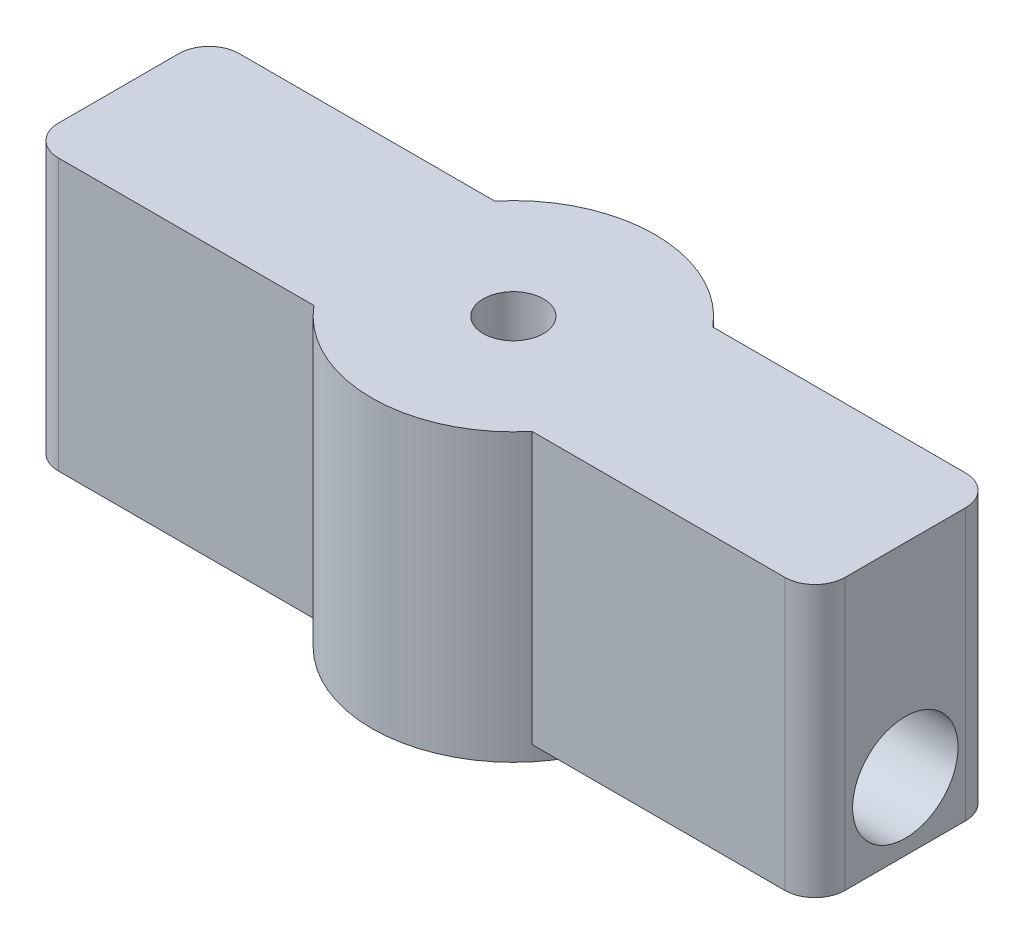
ISO-10303-21;
HEADER;
FILE_DESCRIPTION(('STEP AP214'),'2;1');
FILE_NAME('part.step','',(''),(''),'','','');
FILE_SCHEMA(('AUTOMOTIVE_DESIGN { 1 0 10303 214 1 1 1 1 }'));
ENDSEC;
DATA;
#1=APPLICATION_CONTEXT('core data for automotive mechanical design processes');
#2=APPLICATION_PROTOCOL_DEFINITION('international standard','automotive_design',2000,#1);
#3=PRODUCT_CONTEXT('',#1,'mechanical');
#4=PRODUCT('Part','Part','',(#3));
#5=PRODUCT_RELATED_PRODUCT_CATEGORY('part','',(#4));
#6=PRODUCT_DEFINITION_FORMATION('','',#4);
#7=PRODUCT_DEFINITION_CONTEXT('part definition',#1,'design');
#8=PRODUCT_DEFINITION('design','',#6,#7);
#9=PRODUCT_DEFINITION_SHAPE('','',#8);
#10=(LENGTH_UNIT() NAMED_UNIT(*) SI_UNIT(.MILLI.,.METRE.));
#11=(NAMED_UNIT(*) PLANE_ANGLE_UNIT() SI_UNIT($,.RADIAN.));
#12=(NAMED_UNIT(*) SI_UNIT($,.STERADIAN.) SOLID_ANGLE_UNIT());
#13=UNCERTAINTY_MEASURE_WITH_UNIT(LENGTH_MEASURE(1.E-05),#10,'distance_accuracy_value','');
#14=(GEOMETRIC_REPRESENTATION_CONTEXT(3) GLOBAL_UNCERTAINTY_ASSIGNED_CONTEXT((#13)) GLOBAL_UNIT_ASSIGNED_CONTEXT((#10,
#11,#12)) REPRESENTATION_CONTEXT('',''));
#15=CARTESIAN_POINT('',(0.,0.,0.));
#16=DIRECTION('',(0.,0.,1.));
#17=DIRECTION('',(1.,0.,0.));
#18=AXIS2_PLACEMENT_3D('',#15,#16,#17);
#19=CARTESIAN_POINT('',(0.,5.,0.));
#20=DIRECTION('',(0.,-1.,0.));
#21=DIRECTION('',(0.,0.,-1.));
#22=AXIS2_PLACEMENT_3D('',#19,#20,#21);
#23=CYLINDRICAL_SURFACE('',#22,4.7);
#24=CARTESIAN_POINT('',(0.,0.,0.));
#25=DIRECTION('',(0.,1.,0.));
#26=DIRECTION('',(0.,0.,1.));
#27=AXIS2_PLACEMENT_3D('',#24,#25,#26);
#28=CIRCLE('',#27,4.7);
#29=CARTESIAN_POINT('',(0.,0.,4.7));
#30=VERTEX_POINT('',#29);
#31=EDGE_CURVE('E164',#30,#30,#28,.T.);
#32=ORIENTED_EDGE('',*,*,#31,.T.);
#33=EDGE_LOOP('',(#32));
#34=FACE_BOUND('',#33,.T.);
#35=DIRECTION('',(0.,1.,0.));
#36=VECTOR('',#35,1.);
#37=CARTESIAN_POINT('',(-3.61801050302511,-10.7208789682779,3.));
#38=LINE('',#37,#36);
#39=CARTESIAN_POINT('',(-3.61801050302511,0.499999999999999,3.));
#40=VERTEX_POINT('',#39);
#41=CARTESIAN_POINT('',(-3.61801050302511,9.5,3.));
#42=VERTEX_POINT('',#41);
#43=EDGE_CURVE('E134',#40,#42,#38,.T.);
#44=ORIENTED_EDGE('',*,*,#43,.F.);
#45=CARTESIAN_POINT('',(0.,0.5,0.));
#46=DIRECTION('',(0.,1.,0.));
#47=DIRECTION('',(0.,0.,1.));
#48=AXIS2_PLACEMENT_3D('',#45,#46,#47);
#49=CIRCLE('',#48,4.7);
#50=CARTESIAN_POINT('',(-3.61801050302511,0.500000000000001,-3.));
#51=VERTEX_POINT('',#50);
#52=EDGE_CURVE('E143',#40,#51,#49,.F.);
#53=ORIENTED_EDGE('',*,*,#52,.T.);
#54=DIRECTION('',(0.,1.,0.));
#55=VECTOR('',#54,1.);
#56=CARTESIAN_POINT('',(-3.61801050302511,-10.7208789682779,-3.));
#57=LINE('',#56,#55);
#58=CARTESIAN_POINT('',(-3.61801050302511,9.5,-3.));
#59=VERTEX_POINT('',#58);
#60=EDGE_CURVE('E129',#51,#59,#57,.T.);
#61=ORIENTED_EDGE('',*,*,#60,.T.);
#62=CARTESIAN_POINT('',(0.,9.5,0.));
#63=DIRECTION('',(0.,1.,0.));
#64=DIRECTION('',(0.,0.,1.));
#65=AXIS2_PLACEMENT_3D('',#62,#63,#64);
#66=CIRCLE('',#65,4.7);
#67=CARTESIAN_POINT('',(3.61801050302511,9.5,-3.));
#68=VERTEX_POINT('',#67);
#69=EDGE_CURVE('E140',#68,#59,#66,.T.);
#70=ORIENTED_EDGE('',*,*,#69,.F.);
#71=DIRECTION('',(0.,-1.,0.));
#72=VECTOR('',#71,1.);
#73=CARTESIAN_POINT('',(3.61801050302511,5.,-3.));
#74=LINE('',#73,#72);
#75=CARTESIAN_POINT('',(3.61801050302511,0.5,-3.));
#76=VERTEX_POINT('',#75);
#77=EDGE_CURVE('E170',#76,#68,#74,.F.);
#78=ORIENTED_EDGE('',*,*,#77,.F.);
#79=CARTESIAN_POINT('',(0.,0.5,0.));
#80=DIRECTION('',(0.,1.,0.));
#81=DIRECTION('',(0.,0.,1.));
#82=AXIS2_PLACEMENT_3D('',#79,#80,#81);
#83=CIRCLE('',#82,4.7);
#84=CARTESIAN_POINT('',(3.61801050302511,0.499999999999999,3.));
#85=VERTEX_POINT('',#84);
#86=EDGE_CURVE('E167',#85,#76,#83,.T.);
#87=ORIENTED_EDGE('',*,*,#86,.F.);
#88=DIRECTION('',(0.,-1.,0.));
#89=VECTOR('',#88,1.);
#90=CARTESIAN_POINT('',(3.61801050302511,5.,3.));
#91=LINE('',#90,#89);
#92=CARTESIAN_POINT('',(3.61801050302511,9.5,3.));
#93=VERTEX_POINT('',#92);
#94=EDGE_CURVE('E172',#93,#85,#91,.T.);
#95=ORIENTED_EDGE('',*,*,#94,.F.);
#96=EDGE_CURVE('E152',#42,#93,#66,.T.);
#97=ORIENTED_EDGE('',*,*,#96,.F.);
#98=EDGE_LOOP('',(#44,#53,#61,#70,#78,#87,#95,#97));
#99=FACE_BOUND('',#98,.T.);
#100=ADVANCED_FACE('F34',(#34,#99),#23,.T.);
#101=CARTESIAN_POINT('',(0.,0.,0.));
#102=DIRECTION('',(0.,1.,0.));
#103=DIRECTION('',(0.,0.,1.));
#104=AXIS2_PLACEMENT_3D('',#101,#102,#103);
#105=PLANE('',#104);
#106=ORIENTED_EDGE('',*,*,#31,.F.);
#107=EDGE_LOOP('',(#106));
#108=FACE_BOUND('',#107,.T.);
#109=CARTESIAN_POINT('',(0.,0.,0.));
#110=DIRECTION('',(0.,1.,0.));
#111=DIRECTION('',(0.,0.,1.));
#112=AXIS2_PLACEMENT_3D('',#109,#110,#111);
#113=CIRCLE('',#112,2.5);
#114=CARTESIAN_POINT('',(0.,0.,2.5));
#115=VERTEX_POINT('',#114);
#116=EDGE_CURVE('E155',#115,#115,#113,.T.);
#117=ORIENTED_EDGE('',*,*,#116,.T.);
#118=EDGE_LOOP('',(#117));
#119=FACE_BOUND('',#118,.T.);
#120=ADVANCED_FACE('F263',(#108,#119),#105,.F.);
#121=CARTESIAN_POINT('',(0.,5.,0.));
#122=DIRECTION('',(0.,-1.,0.));
#123=DIRECTION('',(0.,0.,-1.));
#124=AXIS2_PLACEMENT_3D('',#121,#122,#123);
#125=CYLINDRICAL_SURFACE('',#124,2.5);
#126=CARTESIAN_POINT('',(-1.78535710713571,2.75,-1.75));
#127=CARTESIAN_POINT('',(-1.78536365232842,2.83400098508107,-1.74999668470244));
#128=CARTESIAN_POINT('',(-1.79140301018335,2.91802043931462,-1.74389521209419));
#129=CARTESIAN_POINT('',(-1.81428207856453,3.08294383729901,-1.72006710575696));
#130=CARTESIAN_POINT('',(-1.83114580062352,3.16384042964181,-1.70231462478913));
#131=CARTESIAN_POINT('',(-1.87249938059928,3.31951493609264,-1.65670498667527));
#132=CARTESIAN_POINT('',(-1.89690320720833,3.39435042320693,-1.62896126458866));
#133=CARTESIAN_POINT('',(-1.95043473735259,3.53813317548126,-1.5644680426432));
#134=CARTESIAN_POINT('',(-1.97956276982564,3.60708003011587,-1.52771791559367));
#135=CARTESIAN_POINT('',(-2.04535102275824,3.75034781373763,-1.43878621662413));
#136=CARTESIAN_POINT('',(-2.08243700207531,3.82349539939997,-1.38502929897584));
#137=CARTESIAN_POINT('',(-2.1564208214175,3.96078033482705,-1.26677845799128));
#138=CARTESIAN_POINT('',(-2.19331837146343,4.02490641048543,-1.20227131618142));
#139=CARTESIAN_POINT('',(-2.26996924261653,4.15296567220918,-1.0514437529621));
#140=CARTESIAN_POINT('',(-2.30917478390817,4.21508814900103,-0.963279690235141));
#141=CARTESIAN_POINT('',(-2.37911884375227,4.32301934718343,-0.774507144866142));
#142=CARTESIAN_POINT('',(-2.40987426748605,4.36886069496634,-0.673924100801018));
#143=CARTESIAN_POINT('',(-2.45245937204221,4.43149470864729,-0.491641621204735));
#144=CARTESIAN_POINT('',(-2.46715488574729,4.45278489971455,-0.412145254198864));
#145=CARTESIAN_POINT('',(-2.4888153213972,4.48402185773794,-0.249941853155883));
#146=CARTESIAN_POINT('',(-2.49578641573295,4.4939776818789,-0.167237437370548));
#147=CARTESIAN_POINT('',(-2.50138893131686,4.50198591183946,-0.000805953099351412));
#148=CARTESIAN_POINT('',(-2.50000415567629,4.50001519942381,0.0829227873690355));
#149=CARTESIAN_POINT('',(-2.48898580019574,4.48423806047393,0.248708367620934));
#150=CARTESIAN_POINT('',(-2.47934992009681,4.47042833343492,0.330764734645333));
#151=CARTESIAN_POINT('',(-2.45297594957067,4.43219398765832,0.489091678965589));
#152=CARTESIAN_POINT('',(-2.43640494040199,4.40801877864625,0.565451554473574));
#153=CARTESIAN_POINT('',(-2.3974241748025,4.35018684940599,0.712866124373188));
#154=CARTESIAN_POINT('',(-2.37501327141354,4.31652826653279,0.783919773088349));
#155=CARTESIAN_POINT('',(-2.32302570425101,4.23659822825355,0.92736494885482));
#156=CARTESIAN_POINT('',(-2.2929270864848,4.18933513459608,0.999011535436184));
#157=CARTESIAN_POINT('',(-2.22936304366409,4.08575189499401,1.13380163072984));
#158=CARTESIAN_POINT('',(-2.1958940072484,4.02942199458079,1.19693584549685));
#159=CARTESIAN_POINT('',(-2.1217040880619,3.89786836950175,1.32466884852146));
#160=CARTESIAN_POINT('',(-2.08075557422617,3.82106700492145,1.38751556001384));
#161=CARTESIAN_POINT('',(-2.00128404549408,3.657075420374,1.49986258412796));
#162=CARTESIAN_POINT('',(-1.96276040583434,3.56988789326223,1.54936634540833));
#163=CARTESIAN_POINT('',(-1.90133168615619,3.40713907420022,1.62379387354891));
#164=CARTESIAN_POINT('',(-1.87687572628151,3.33356209549787,1.6517550759101));
#165=CARTESIAN_POINT('',(-1.83530095032361,3.18145306320949,1.69783359991293));
#166=CARTESIAN_POINT('',(-1.81816842537049,3.10293058628107,1.71596933120923));
#167=CARTESIAN_POINT('',(-1.79384395713168,2.94170997459459,1.7413948338882));
#168=CARTESIAN_POINT('',(-1.78675445152955,2.85897760280312,1.74857289482399));
#169=CARTESIAN_POINT('',(-1.78434054379133,2.69317097607153,1.7510385880738));
#170=CARTESIAN_POINT('',(-1.78901185251409,2.61009685679791,1.74633055521635));
#171=CARTESIAN_POINT('',(-1.80768760487068,2.45820930977385,1.72696239874666));
#172=CARTESIAN_POINT('',(-1.8203046319629,2.38901860168511,1.71377642758929));
#173=CARTESIAN_POINT('',(-1.8517999024481,2.25403816283819,1.679694996125));
#174=CARTESIAN_POINT('',(-1.87068474477724,2.18825210132994,1.65879140787065));
#175=CARTESIAN_POINT('',(-1.92274158237606,2.03077034820005,1.59852896713013));
#176=CARTESIAN_POINT('',(-1.95845312500197,1.94146803919049,1.55511505325273));
#177=CARTESIAN_POINT('',(-2.03399599544424,1.77257282529334,1.4549264851744));
#178=CARTESIAN_POINT('',(-2.07383528916823,1.69299936548853,1.39812571684052));
#179=CARTESIAN_POINT('',(-2.15418669583294,1.54289577920871,1.2709251028698));
#180=CARTESIAN_POINT('',(-2.1946973173828,1.47256465844528,1.20028884551029));
#181=CARTESIAN_POINT('',(-2.27185413151566,1.34413851518448,1.04691346170575));
#182=CARTESIAN_POINT('',(-2.30850595042205,1.28602555111756,0.96419238810028));
#183=CARTESIAN_POINT('',(-2.36919526820174,1.19223142992906,0.801972977832252));
#184=CARTESIAN_POINT('',(-2.39431368424312,1.15444480691776,0.724101828752622));
#185=CARTESIAN_POINT('',(-2.43747683045928,1.09037477182327,0.561899898340579));
#186=CARTESIAN_POINT('',(-2.45552585079696,1.06408438195674,0.477573071991887));
#187=CARTESIAN_POINT('',(-2.48300657254176,1.02430272688604,0.304026348647543));
#188=CARTESIAN_POINT('',(-2.4923884789659,1.01088540426302,0.214781260897288));
#189=CARTESIAN_POINT('',(-2.50137827965738,0.998025018326271,0.0348055388819908));
#190=CARTESIAN_POINT('',(-2.50098998643309,0.998576504131764,-0.0559245021160239));
#191=CARTESIAN_POINT('',(-2.49101138192816,1.01285949256849,-0.226908148208792));
#192=CARTESIAN_POINT('',(-2.48231388173466,1.02531226870284,-0.307326916753019));
#193=CARTESIAN_POINT('',(-2.45773771003211,1.06087611828671,-0.464612376244542));
#194=CARTESIAN_POINT('',(-2.44185767243074,1.08398921930747,-0.541478388403845));
#195=CARTESIAN_POINT('',(-2.40344767867576,1.14080323386533,-0.692630046920312));
#196=CARTESIAN_POINT('',(-2.38070436495182,1.17484651008378,-0.766731128366442));
#197=CARTESIAN_POINT('',(-2.33039638985978,1.25196779410319,-0.908240418312736));
#198=CARTESIAN_POINT('',(-2.3028307960369,1.29504754955408,-0.975647328442925));
#199=CARTESIAN_POINT('',(-2.23999116004928,1.3965245392116,-1.11310524604693));
#200=CARTESIAN_POINT('',(-2.20418577912312,1.45626361794321,-1.18192132257827));
#201=CARTESIAN_POINT('',(-2.13102660052163,1.58526808263679,-1.30924982295531));
#202=CARTESIAN_POINT('',(-2.09366969893854,1.65455327764107,-1.36774022884757));
#203=CARTESIAN_POINT('',(-2.01471303450108,1.8134720055012,-1.48204711893856));
#204=CARTESIAN_POINT('',(-1.9733701022534,1.90459200750297,-1.53599603072894));
#205=CARTESIAN_POINT('',(-1.89871813385105,2.0977205059177,-1.627377581911));
#206=CARTESIAN_POINT('',(-1.86538488501279,2.19969480667085,-1.66486028939109));
#207=CARTESIAN_POINT('',(-1.82254477153272,2.37726530873243,-1.71142779429956));
#208=CARTESIAN_POINT('',(-1.80880418551828,2.45043849135374,-1.72580405858133));
#209=CARTESIAN_POINT('',(-1.79021518690061,2.5990723032766,-1.74508336851488));
#210=CARTESIAN_POINT('',(-1.78535122655919,2.67452869725181,-1.75000297865347));
#211=CARTESIAN_POINT('',(-1.78535710713571,2.75,-1.75));
#212=B_SPLINE_CURVE_WITH_KNOTS('',3,(#126,#127,#128,#129,#130,#131,#132,#133,#134,#135,#136,
#137,#138,#139,#140,#141,#142,#143,#144,#145,#146,#147,#148,#149,#150,#151,#152,#153,#154,#155,
#156,#157,#158,#159,#160,#161,#162,#163,#164,#165,#166,#167,#168,#169,#170,#171,#172,#173,#174,
#175,#176,#177,#178,#179,#180,#181,#182,#183,#184,#185,#186,#187,#188,#189,#190,#191,#192,#193,
#194,#195,#196,#197,#198,#199,#200,#201,#202,#203,#204,#205,#206,#207,#208,#209,#210,#211),
.UNSPECIFIED.,.T.,.F.,(4,2,2,2,2,2,2,2,2,2,2,2,2,2,2,2,2,2,2,2,2,2,2,2,2,2,2,2,2,2,2,2,2,2,2,2,
2,2,2,2,2,2,4),(0.,0.251644352862943,0.503848863092812,0.753275865950746,1.00272024341801,
1.29584807815702,1.58933903876421,1.93170814842452,2.27338724778376,2.52311133695241,
2.77263573360097,3.02264395964273,3.27272190616391,3.51709337531477,3.76151287536607,
4.03336573621144,4.30551304756613,4.62626324788577,4.94693046648402,5.19332741197632,
5.43926108098983,5.68768561592646,5.93601956414821,6.14983844698567,6.36388316239659,
6.67875939439456,6.99425502444262,7.31570467879083,7.6366789565262,7.90595122268596,
8.17505982302552,8.44570508287669,8.7162447336979,8.9606422999123,9.20508636920796,
9.45808878225994,9.71114017102311,10.003763719812,10.2970038996666,10.6363668560714,
10.9746906604828,11.201179465444,11.427271184743),.UNSPECIFIED.);
#213=CARTESIAN_POINT('',(-1.78535710713571,2.75,-1.75));
#214=VERTEX_POINT('',#213);
#215=EDGE_CURVE('E218',#214,#214,#212,.T.);
#216=ORIENTED_EDGE('',*,*,#215,.F.);
#217=EDGE_LOOP('',(#216));
#218=FACE_BOUND('',#217,.T.);
#219=CARTESIAN_POINT('',(1.78535710713571,2.75,-1.75));
#220=CARTESIAN_POINT('',(1.78536365232842,2.66599901491893,-1.74999668470244));
#221=CARTESIAN_POINT('',(1.79140301018335,2.58197956068538,-1.74389521209419));
#222=CARTESIAN_POINT('',(1.81428207856453,2.41705616270099,-1.72006710575696));
#223=CARTESIAN_POINT('',(1.83114580062352,2.3361595703582,-1.70231462478913));
#224=CARTESIAN_POINT('',(1.87249938059928,2.18048506390736,-1.65670498667527));
#225=CARTESIAN_POINT('',(1.89690320720833,2.10564957679308,-1.62896126458866));
#226=CARTESIAN_POINT('',(1.95043473735259,1.96186682451874,-1.5644680426432));
#227=CARTESIAN_POINT('',(1.97956276982564,1.89291996988413,-1.52771791559367));
#228=CARTESIAN_POINT('',(2.04535102275824,1.74965218626237,-1.43878621662413));
#229=CARTESIAN_POINT('',(2.08243700207531,1.67650460060003,-1.38502929897584));
#230=CARTESIAN_POINT('',(2.1564208214175,1.53921966517295,-1.26677845799128));
#231=CARTESIAN_POINT('',(2.19331837146343,1.47509358951457,-1.20227131618142));
#232=CARTESIAN_POINT('',(2.26996924261653,1.34703432779082,-1.0514437529621));
#233=CARTESIAN_POINT('',(2.30917478390817,1.28491185099897,-0.963279690235142));
#234=CARTESIAN_POINT('',(2.37911884375227,1.17698065281657,-0.774507144866142));
#235=CARTESIAN_POINT('',(2.40987426748605,1.13113930503366,-0.673924100801018));
#236=CARTESIAN_POINT('',(2.45245937204221,1.06850529135271,-0.491641621204735));
#237=CARTESIAN_POINT('',(2.46715488574729,1.04721510028545,-0.412145254198864));
#238=CARTESIAN_POINT('',(2.4888153213972,1.01597814226206,-0.249941853155882));
#239=CARTESIAN_POINT('',(2.49578641573295,1.00602231812111,-0.167237437370547));
#240=CARTESIAN_POINT('',(2.50138893131686,0.998014088160546,-0.000805953099350328));
#241=CARTESIAN_POINT('',(2.50000415567629,0.999984800576192,0.0829227873690365));
#242=CARTESIAN_POINT('',(2.48898580019574,1.01576193952607,0.248708367620935));
#243=CARTESIAN_POINT('',(2.47934992009681,1.02957166656508,0.330764734645334));
#244=CARTESIAN_POINT('',(2.45297594957067,1.06780601234168,0.489091678965591));
#245=CARTESIAN_POINT('',(2.43640494040199,1.09198122135375,0.565451554473576));
#246=CARTESIAN_POINT('',(2.3974241748025,1.14981315059401,0.712866124373189));
#247=CARTESIAN_POINT('',(2.37501327141354,1.18347173346721,0.78391977308835));
#248=CARTESIAN_POINT('',(2.32302570425101,1.26340177174645,0.927364948854821));
#249=CARTESIAN_POINT('',(2.2929270864848,1.31066486540393,0.999011535436185));
#250=CARTESIAN_POINT('',(2.22936304366409,1.41424810500599,1.13380163072984));
#251=CARTESIAN_POINT('',(2.1958940072484,1.47057800541921,1.19693584549686));
#252=CARTESIAN_POINT('',(2.1217040880619,1.60213163049825,1.32466884852146));
#253=CARTESIAN_POINT('',(2.08075557422617,1.67893299507855,1.38751556001384));
#254=CARTESIAN_POINT('',(2.00128404549408,1.842924579626,1.49986258412797));
#255=CARTESIAN_POINT('',(1.96276040583434,1.93011210673778,1.54936634540833));
#256=CARTESIAN_POINT('',(1.90133168615619,2.09286092579979,1.62379387354891));
#257=CARTESIAN_POINT('',(1.87687572628151,2.16643790450214,1.6517550759101));
#258=CARTESIAN_POINT('',(1.83530095032361,2.31854693679051,1.69783359991293));
#259=CARTESIAN_POINT('',(1.81816842537049,2.39706941371893,1.71596933120923));
#260=CARTESIAN_POINT('',(1.79384395713168,2.55829002540541,1.7413948338882));
#261=CARTESIAN_POINT('',(1.78675445152955,2.64102239719688,1.74857289482399));
#262=CARTESIAN_POINT('',(1.78434054379133,2.80682902392847,1.7510385880738));
#263=CARTESIAN_POINT('',(1.78901185251409,2.88990314320209,1.74633055521635));
#264=CARTESIAN_POINT('',(1.80768760487068,3.04179069022616,1.72696239874666));
#265=CARTESIAN_POINT('',(1.8203046319629,3.1109813983149,1.71377642758929));
#266=CARTESIAN_POINT('',(1.8517999024481,3.24596183716181,1.679694996125));
#267=CARTESIAN_POINT('',(1.87068474477725,3.31174789867006,1.65879140787065));
#268=CARTESIAN_POINT('',(1.92274158237606,3.46922965179995,1.59852896713013));
#269=CARTESIAN_POINT('',(1.95845312500197,3.55853196080951,1.55511505325273));
#270=CARTESIAN_POINT('',(2.03399599544424,3.72742717470666,1.45492648517439));
#271=CARTESIAN_POINT('',(2.07383528916823,3.80700063451148,1.39812571684051));
#272=CARTESIAN_POINT('',(2.15418669583295,3.9571042207913,1.2709251028698));
#273=CARTESIAN_POINT('',(2.1946973173828,4.02743534155473,1.20028884551029));
#274=CARTESIAN_POINT('',(2.27185413151566,4.15586148481552,1.04691346170575));
#275=CARTESIAN_POINT('',(2.30850595042205,4.21397444888245,0.964192388100278));
#276=CARTESIAN_POINT('',(2.36919526820174,4.30776857007094,0.801972977832249));
#277=CARTESIAN_POINT('',(2.39431368424312,4.34555519308224,0.72410182875262));
#278=CARTESIAN_POINT('',(2.43747683045928,4.40962522817673,0.561899898340577));
#279=CARTESIAN_POINT('',(2.45552585079696,4.43591561804327,0.477573071991885));
#280=CARTESIAN_POINT('',(2.48300657254176,4.47569727311396,0.304026348647541));
#281=CARTESIAN_POINT('',(2.4923884789659,4.48911459573698,0.214781260897286));
#282=CARTESIAN_POINT('',(2.50137827965738,4.50197498167373,0.0348055388819897));
#283=CARTESIAN_POINT('',(2.50098998643309,4.50142349586824,-0.0559245021160252));
#284=CARTESIAN_POINT('',(2.49101138192816,4.48714050743151,-0.226908148208793));
#285=CARTESIAN_POINT('',(2.48231388173466,4.47468773129716,-0.30732691675302));
#286=CARTESIAN_POINT('',(2.45773771003211,4.43912388171329,-0.464612376244543));
#287=CARTESIAN_POINT('',(2.44185767243074,4.41601078069253,-0.541478388403846));
#288=CARTESIAN_POINT('',(2.40344767867576,4.35919676613467,-0.692630046920314));
#289=CARTESIAN_POINT('',(2.38070436495182,4.32515348991622,-0.766731128366445));
#290=CARTESIAN_POINT('',(2.33039638985978,4.24803220589681,-0.908240418312738));
#291=CARTESIAN_POINT('',(2.3028307960369,4.20495245044592,-0.975647328442927));
#292=CARTESIAN_POINT('',(2.23999116004928,4.10347546078839,-1.11310524604694));
#293=CARTESIAN_POINT('',(2.20418577912312,4.04373638205679,-1.18192132257827));
#294=CARTESIAN_POINT('',(2.13102660052163,3.91473191736321,-1.30924982295531));
#295=CARTESIAN_POINT('',(2.09366969893854,3.84544672235893,-1.36774022884757));
#296=CARTESIAN_POINT('',(2.01471303450108,3.6865279944988,-1.48204711893857));
#297=CARTESIAN_POINT('',(1.9733701022534,3.59540799249703,-1.53599603072894));
#298=CARTESIAN_POINT('',(1.89871813385105,3.4022794940823,-1.627377581911));
#299=CARTESIAN_POINT('',(1.86538488501279,3.30030519332915,-1.66486028939109));
#300=CARTESIAN_POINT('',(1.82254477153272,3.12273469126757,-1.71142779429956));
#301=CARTESIAN_POINT('',(1.80880418551828,3.04956150864626,-1.72580405858133));
#302=CARTESIAN_POINT('',(1.79021518690061,2.9009276967234,-1.74508336851488));
#303=CARTESIAN_POINT('',(1.78535122655919,2.8254713027482,-1.75000297865347));
#304=CARTESIAN_POINT('',(1.78535710713571,2.75,-1.75));
#305=B_SPLINE_CURVE_WITH_KNOTS('',3,(#219,#220,#221,#222,#223,#224,#225,#226,#227,#228,#229,
#230,#231,#232,#233,#234,#235,#236,#237,#238,#239,#240,#241,#242,#243,#244,#245,#246,#247,#248,
#249,#250,#251,#252,#253,#254,#255,#256,#257,#258,#259,#260,#261,#262,#263,#264,#265,#266,#267,
#268,#269,#270,#271,#272,#273,#274,#275,#276,#277,#278,#279,#280,#281,#282,#283,#284,#285,#286,
#287,#288,#289,#290,#291,#292,#293,#294,#295,#296,#297,#298,#299,#300,#301,#302,#303,#304),
.UNSPECIFIED.,.T.,.F.,(4,2,2,2,2,2,2,2,2,2,2,2,2,2,2,2,2,2,2,2,2,2,2,2,2,2,2,2,2,2,2,2,2,2,2,2,
2,2,2,2,2,2,4),(0.,0.251644352862943,0.503848863092812,0.753275865950746,1.00272024341801,
1.29584807815701,1.58933903876421,1.93170814842452,2.27338724778376,2.52311133695241,
2.77263573360097,3.02264395964273,3.27272190616391,3.51709337531477,3.76151287536607,
4.03336573621144,4.30551304756613,4.62626324788577,4.94693046648402,5.19332741197632,
5.43926108098983,5.68768561592646,5.93601956414821,6.14983844698567,6.36388316239659,
6.67875939439456,6.99425502444262,7.31570467879083,7.63667895652621,7.90595122268596,
8.17505982302552,8.44570508287669,8.7162447336979,8.9606422999123,9.20508636920796,
9.45808878225994,9.71114017102311,10.003763719812,10.2970038996666,10.6363668560714,
10.9746906604828,11.201179465444,11.427271184743),.UNSPECIFIED.);
#306=CARTESIAN_POINT('',(1.78535710713571,2.75,-1.75));
#307=VERTEX_POINT('',#306);
#308=EDGE_CURVE('E389',#307,#307,#305,.T.);
#309=ORIENTED_EDGE('',*,*,#308,.F.);
#310=EDGE_LOOP('',(#309));
#311=FACE_BOUND('',#310,.T.);
#312=CARTESIAN_POINT('',(0.,5.,0.));
#313=DIRECTION('',(0.,1.,0.));
#314=DIRECTION('',(0.,0.,1.));
#315=AXIS2_PLACEMENT_3D('',#312,#313,#314);
#316=CIRCLE('',#315,2.5);
#317=CARTESIAN_POINT('',(0.,5.,2.5));
#318=VERTEX_POINT('',#317);
#319=EDGE_CURVE('E151',#318,#318,#316,.T.);
#320=ORIENTED_EDGE('',*,*,#319,.T.);
#321=EDGE_LOOP('',(#320));
#322=FACE_BOUND('',#321,.T.);
#323=ORIENTED_EDGE('',*,*,#116,.F.);
#324=EDGE_LOOP('',(#323));
#325=FACE_BOUND('',#324,.T.);
#326=ADVANCED_FACE('F260',(#218,#311,#322,#325),#125,.F.);
#327=CARTESIAN_POINT('',(0.,5.,0.));
#328=DIRECTION('',(0.,1.,0.));
#329=DIRECTION('',(0.,0.,1.));
#330=AXIS2_PLACEMENT_3D('',#327,#328,#329);
#331=PLANE('',#330);
#332=CARTESIAN_POINT('',(0.,5.,0.));
#333=DIRECTION('',(0.,1.,0.));
#334=DIRECTION('',(0.,0.,1.));
#335=AXIS2_PLACEMENT_3D('',#332,#333,#334);
#336=CIRCLE('',#335,1.);
#337=CARTESIAN_POINT('',(0.,5.,1.));
#338=VERTEX_POINT('',#337);
#339=EDGE_CURVE('E157',#338,#338,#336,.T.);
#340=ORIENTED_EDGE('',*,*,#339,.T.);
#341=EDGE_LOOP('',(#340));
#342=FACE_BOUND('',#341,.T.);
#343=ORIENTED_EDGE('',*,*,#319,.F.);
#344=EDGE_LOOP('',(#343));
#345=FACE_BOUND('',#344,.T.);
#346=ADVANCED_FACE('F251',(#342,#345),#331,.F.);
#347=CARTESIAN_POINT('',(0.,9.5,0.));
#348=DIRECTION('',(0.,1.,0.));
#349=DIRECTION('',(0.,0.,1.));
#350=AXIS2_PLACEMENT_3D('',#347,#348,#349);
#351=PLANE('',#350);
#352=CARTESIAN_POINT('',(0.,9.5,0.));
#353=DIRECTION('',(0.,1.,0.));
#354=DIRECTION('',(0.,0.,1.));
#355=AXIS2_PLACEMENT_3D('',#352,#353,#354);
#356=CIRCLE('',#355,1.);
#357=CARTESIAN_POINT('',(0.,9.5,1.));
#358=VERTEX_POINT('',#357);
#359=EDGE_CURVE('E159',#358,#358,#356,.T.);
#360=ORIENTED_EDGE('',*,*,#359,.F.);
#361=EDGE_LOOP('',(#360));
#362=FACE_BOUND('',#361,.T.);
#363=DIRECTION('',(0.,0.,-1.));
#364=VECTOR('',#363,1.);
#365=CARTESIAN_POINT('',(-13.1,9.5,0.));
#366=LINE('',#365,#364);
#367=CARTESIAN_POINT('',(-13.1,9.5,2.));
#368=VERTEX_POINT('',#367);
#369=CARTESIAN_POINT('',(-13.1,9.5,-2.));
#370=VERTEX_POINT('',#369);
#371=EDGE_CURVE('E214',#368,#370,#366,.T.);
#372=ORIENTED_EDGE('',*,*,#371,.F.);
#373=CARTESIAN_POINT('',(-12.1,9.5,2.));
#374=DIRECTION('',(0.,1.,0.));
#375=DIRECTION('',(0.,0.,1.));
#376=AXIS2_PLACEMENT_3D('',#373,#374,#375);
#377=CIRCLE('',#376,1.);
#378=CARTESIAN_POINT('',(-12.1,9.5,3.));
#379=VERTEX_POINT('',#378);
#380=EDGE_CURVE('E195',#368,#379,#377,.T.);
#381=ORIENTED_EDGE('',*,*,#380,.T.);
#382=DIRECTION('',(-1.,0.,0.));
#383=VECTOR('',#382,1.);
#384=CARTESIAN_POINT('',(0.,9.5,3.));
#385=LINE('',#384,#383);
#386=EDGE_CURVE('E135',#42,#379,#385,.T.);
#387=ORIENTED_EDGE('',*,*,#386,.F.);
#388=ORIENTED_EDGE('',*,*,#96,.T.);
#389=DIRECTION('',(1.,0.,0.));
#390=VECTOR('',#389,1.);
#391=CARTESIAN_POINT('',(3.61801050302511,9.5,3.));
#392=LINE('',#391,#390);
#393=CARTESIAN_POINT('',(12.01,9.5,3.));
#394=VERTEX_POINT('',#393);
#395=EDGE_CURVE('E209',#93,#394,#392,.T.);
#396=ORIENTED_EDGE('',*,*,#395,.T.);
#397=CARTESIAN_POINT('',(12.01,9.5,2.));
#398=DIRECTION('',(0.,1.,0.));
#399=DIRECTION('',(0.,0.,1.));
#400=AXIS2_PLACEMENT_3D('',#397,#398,#399);
#401=CIRCLE('',#400,1.);
#402=CARTESIAN_POINT('',(13.01,9.5,2.));
#403=VERTEX_POINT('',#402);
#404=EDGE_CURVE('E230',#394,#403,#401,.T.);
#405=ORIENTED_EDGE('',*,*,#404,.T.);
#406=DIRECTION('',(0.,0.,-1.));
#407=VECTOR('',#406,1.);
#408=CARTESIAN_POINT('',(13.01,9.5,2.));
#409=LINE('',#408,#407);
#410=CARTESIAN_POINT('',(13.01,9.5,-2.));
#411=VERTEX_POINT('',#410);
#412=EDGE_CURVE('E227',#403,#411,#409,.T.);
#413=ORIENTED_EDGE('',*,*,#412,.T.);
#414=CARTESIAN_POINT('',(12.01,9.5,-2.));
#415=DIRECTION('',(0.,1.,0.));
#416=DIRECTION('',(0.,0.,1.));
#417=AXIS2_PLACEMENT_3D('',#414,#415,#416);
#418=CIRCLE('',#417,1.);
#419=CARTESIAN_POINT('',(12.01,9.5,-3.));
#420=VERTEX_POINT('',#419);
#421=EDGE_CURVE('E225',#411,#420,#418,.T.);
#422=ORIENTED_EDGE('',*,*,#421,.T.);
#423=DIRECTION('',(-1.,0.,0.));
#424=VECTOR('',#423,1.);
#425=CARTESIAN_POINT('',(12.01,9.5,-3.));
#426=LINE('',#425,#424);
#427=EDGE_CURVE('E150',#420,#68,#426,.T.);
#428=ORIENTED_EDGE('',*,*,#427,.T.);
#429=ORIENTED_EDGE('',*,*,#69,.T.);
#430=DIRECTION('',(-1.,0.,0.));
#431=VECTOR('',#430,1.);
#432=CARTESIAN_POINT('',(0.,9.5,-3.));
#433=LINE('',#432,#431);
#434=CARTESIAN_POINT('',(-12.1,9.5,-3.));
#435=VERTEX_POINT('',#434);
#436=EDGE_CURVE('E126',#59,#435,#433,.T.);
#437=ORIENTED_EDGE('',*,*,#436,.T.);
#438=CARTESIAN_POINT('',(-12.1,9.5,-2.));
#439=DIRECTION('',(0.,1.,0.));
#440=DIRECTION('',(0.,0.,1.));
#441=AXIS2_PLACEMENT_3D('',#438,#439,#440);
#442=CIRCLE('',#441,1.);
#443=EDGE_CURVE('E193',#435,#370,#442,.T.);
#444=ORIENTED_EDGE('',*,*,#443,.T.);
#445=EDGE_LOOP('',(#372,#381,#387,#388,#396,#405,#413,#422,#428,#429,#437,#444));
#446=FACE_BOUND('',#445,.T.);
#447=ADVANCED_FACE('F147',(#362,#446),#351,.T.);
#448=CARTESIAN_POINT('',(0.,5.,0.));
#449=DIRECTION('',(0.,1.,0.));
#450=DIRECTION('',(0.,0.,1.));
#451=AXIS2_PLACEMENT_3D('',#448,#449,#450);
#452=CYLINDRICAL_SURFACE('',#451,1.);
#453=ORIENTED_EDGE('',*,*,#339,.F.);
#454=EDGE_LOOP('',(#453));
#455=FACE_BOUND('',#454,.T.);
#456=ORIENTED_EDGE('',*,*,#359,.T.);
#457=EDGE_LOOP('',(#456));
#458=FACE_BOUND('',#457,.T.);
#459=ADVANCED_FACE('F248',(#455,#458),#452,.F.);
#460=CARTESIAN_POINT('',(2.7,6.5,-3.));
#461=DIRECTION('',(0.,0.,1.));
#462=DIRECTION('',(0.,-1.,0.));
#463=AXIS2_PLACEMENT_3D('',#460,#461,#462);
#464=PLANE('',#463);
#465=ORIENTED_EDGE('',*,*,#77,.T.);
#466=ORIENTED_EDGE('',*,*,#427,.F.);
#467=DIRECTION('',(0.,1.,0.));
#468=VECTOR('',#467,1.);
#469=CARTESIAN_POINT('',(12.01,6.5,-3.));
#470=LINE('',#469,#468);
#471=CARTESIAN_POINT('',(12.01,0.5,-3.));
#472=VERTEX_POINT('',#471);
#473=EDGE_CURVE('E180',#420,#472,#470,.F.);
#474=ORIENTED_EDGE('',*,*,#473,.T.);
#475=DIRECTION('',(1.,0.,0.));
#476=VECTOR('',#475,1.);
#477=CARTESIAN_POINT('',(2.7,0.5,-3.));
#478=LINE('',#477,#476);
#479=EDGE_CURVE('E240',#76,#472,#478,.T.);
#480=ORIENTED_EDGE('',*,*,#479,.F.);
#481=EDGE_LOOP('',(#465,#466,#474,#480));
#482=FACE_BOUND('',#481,.T.);
#483=ADVANCED_FACE('F257',(#482),#464,.F.);
#484=CARTESIAN_POINT('',(2.7,0.5,-3.));
#485=DIRECTION('',(0.,1.,0.));
#486=DIRECTION('',(0.,0.,1.));
#487=AXIS2_PLACEMENT_3D('',#484,#485,#486);
#488=PLANE('',#487);
#489=ORIENTED_EDGE('',*,*,#479,.T.);
#490=CARTESIAN_POINT('',(12.01,0.5,-2.));
#491=DIRECTION('',(0.,1.,0.));
#492=DIRECTION('',(0.,0.,1.));
#493=AXIS2_PLACEMENT_3D('',#490,#491,#492);
#494=CIRCLE('',#493,1.);
#495=CARTESIAN_POINT('',(13.01,0.5,-2.));
#496=VERTEX_POINT('',#495);
#497=EDGE_CURVE('E184',#472,#496,#494,.F.);
#498=ORIENTED_EDGE('',*,*,#497,.T.);
#499=DIRECTION('',(0.,0.,-1.));
#500=VECTOR('',#499,1.);
#501=CARTESIAN_POINT('',(13.01,0.5,-3.));
#502=LINE('',#501,#500);
#503=CARTESIAN_POINT('',(13.01,0.499999999999999,2.));
#504=VERTEX_POINT('',#503);
#505=EDGE_CURVE('E224',#504,#496,#502,.T.);
#506=ORIENTED_EDGE('',*,*,#505,.F.);
#507=CARTESIAN_POINT('',(12.01,0.499999999999999,2.));
#508=DIRECTION('',(0.,1.,0.));
#509=DIRECTION('',(0.,0.,1.));
#510=AXIS2_PLACEMENT_3D('',#507,#508,#509);
#511=CIRCLE('',#510,1.);
#512=CARTESIAN_POINT('',(12.01,0.499999999999999,3.));
#513=VERTEX_POINT('',#512);
#514=EDGE_CURVE('E182',#504,#513,#511,.F.);
#515=ORIENTED_EDGE('',*,*,#514,.T.);
#516=DIRECTION('',(1.,0.,0.));
#517=VECTOR('',#516,1.);
#518=CARTESIAN_POINT('',(2.7,0.499999999999999,3.));
#519=LINE('',#518,#517);
#520=EDGE_CURVE('E237',#85,#513,#519,.T.);
#521=ORIENTED_EDGE('',*,*,#520,.F.);
#522=ORIENTED_EDGE('',*,*,#86,.T.);
#523=EDGE_LOOP('',(#489,#498,#506,#515,#521,#522));
#524=FACE_BOUND('',#523,.T.);
#525=ADVANCED_FACE('F307',(#524),#488,.F.);
#526=CARTESIAN_POINT('',(2.7,0.499999999999999,3.));
#527=DIRECTION('',(0.,0.,-1.));
#528=DIRECTION('',(0.,1.,0.));
#529=AXIS2_PLACEMENT_3D('',#526,#527,#528);
#530=PLANE('',#529);
#531=ORIENTED_EDGE('',*,*,#520,.T.);
#532=DIRECTION('',(0.,-1.,0.));
#533=VECTOR('',#532,1.);
#534=CARTESIAN_POINT('',(12.01,0.499999999999999,3.));
#535=LINE('',#534,#533);
#536=EDGE_CURVE('E186',#513,#394,#535,.F.);
#537=ORIENTED_EDGE('',*,*,#536,.T.);
#538=ORIENTED_EDGE('',*,*,#395,.F.);
#539=ORIENTED_EDGE('',*,*,#94,.T.);
#540=EDGE_LOOP('',(#531,#537,#538,#539));
#541=FACE_BOUND('',#540,.T.);
#542=ADVANCED_FACE('F303',(#541),#530,.F.);
#543=CARTESIAN_POINT('',(13.01,0.,0.));
#544=DIRECTION('',(-1.,0.,0.));
#545=DIRECTION('',(0.,0.,1.));
#546=AXIS2_PLACEMENT_3D('',#543,#544,#545);
#547=PLANE('',#546);
#548=CARTESIAN_POINT('',(13.01,2.75,0.));
#549=DIRECTION('',(1.,0.,0.));
#550=DIRECTION('',(0.,0.,-1.));
#551=AXIS2_PLACEMENT_3D('',#548,#549,#550);
#552=CIRCLE('',#551,1.75);
#553=CARTESIAN_POINT('',(13.01,2.75,-1.75));
#554=VERTEX_POINT('',#553);
#555=EDGE_CURVE('E392',#554,#554,#552,.T.);
#556=ORIENTED_EDGE('',*,*,#555,.F.);
#557=EDGE_LOOP('',(#556));
#558=FACE_BOUND('',#557,.T.);
#559=ORIENTED_EDGE('',*,*,#505,.T.);
#560=DIRECTION('',(0.,1.,0.));
#561=VECTOR('',#560,1.);
#562=CARTESIAN_POINT('',(13.01,0.,-2.));
#563=LINE('',#562,#561);
#564=EDGE_CURVE('E178',#496,#411,#563,.T.);
#565=ORIENTED_EDGE('',*,*,#564,.T.);
#566=ORIENTED_EDGE('',*,*,#412,.F.);
#567=DIRECTION('',(0.,-1.,0.));
#568=VECTOR('',#567,1.);
#569=CARTESIAN_POINT('',(13.01,0.,2.));
#570=LINE('',#569,#568);
#571=EDGE_CURVE('E175',#403,#504,#570,.T.);
#572=ORIENTED_EDGE('',*,*,#571,.T.);
#573=EDGE_LOOP('',(#559,#565,#566,#572));
#574=FACE_BOUND('',#573,.T.);
#575=ADVANCED_FACE('F277',(#558,#574),#547,.F.);
#576=CARTESIAN_POINT('',(12.01,0.,-2.));
#577=DIRECTION('',(0.,1.,0.));
#578=DIRECTION('',(0.,0.,1.));
#579=AXIS2_PLACEMENT_3D('',#576,#577,#578);
#580=CYLINDRICAL_SURFACE('',#579,1.);
#581=ORIENTED_EDGE('',*,*,#497,.F.);
#582=ORIENTED_EDGE('',*,*,#473,.F.);
#583=ORIENTED_EDGE('',*,*,#421,.F.);
#584=ORIENTED_EDGE('',*,*,#564,.F.);
#585=EDGE_LOOP('',(#581,#582,#583,#584));
#586=FACE_BOUND('',#585,.T.);
#587=ADVANCED_FACE('F273',(#586),#580,.T.);
#588=CARTESIAN_POINT('',(12.01,0.,2.));
#589=DIRECTION('',(0.,-1.,0.));
#590=DIRECTION('',(0.,0.,-1.));
#591=AXIS2_PLACEMENT_3D('',#588,#589,#590);
#592=CYLINDRICAL_SURFACE('',#591,1.);
#593=ORIENTED_EDGE('',*,*,#571,.F.);
#594=ORIENTED_EDGE('',*,*,#404,.F.);
#595=ORIENTED_EDGE('',*,*,#536,.F.);
#596=ORIENTED_EDGE('',*,*,#514,.F.);
#597=EDGE_LOOP('',(#593,#594,#595,#596));
#598=FACE_BOUND('',#597,.T.);
#599=ADVANCED_FACE('F276',(#598),#592,.T.);
#600=CARTESIAN_POINT('',(0.,-10.7208789682779,3.));
#601=DIRECTION('',(0.,0.,-1.));
#602=DIRECTION('',(-1.,0.,0.));
#603=AXIS2_PLACEMENT_3D('',#600,#601,#602);
#604=PLANE('',#603);
#605=ORIENTED_EDGE('',*,*,#386,.T.);
#606=DIRECTION('',(0.,1.,0.));
#607=VECTOR('',#606,1.);
#608=CARTESIAN_POINT('',(-12.1,-10.7208789682779,3.));
#609=LINE('',#608,#607);
#610=CARTESIAN_POINT('',(-12.1,0.499999999999999,3.));
#611=VERTEX_POINT('',#610);
#612=EDGE_CURVE('E58',#379,#611,#609,.F.);
#613=ORIENTED_EDGE('',*,*,#612,.T.);
#614=DIRECTION('',(1.,0.,0.));
#615=VECTOR('',#614,1.);
#616=CARTESIAN_POINT('',(0.,0.499999999999999,3.));
#617=LINE('',#616,#615);
#618=EDGE_CURVE('E144',#611,#40,#617,.T.);
#619=ORIENTED_EDGE('',*,*,#618,.T.);
#620=ORIENTED_EDGE('',*,*,#43,.T.);
#621=EDGE_LOOP('',(#605,#613,#619,#620));
#622=FACE_BOUND('',#621,.T.);
#623=ADVANCED_FACE('F215',(#622),#604,.F.);
#624=CARTESIAN_POINT('',(0.,-10.7208789682779,-3.));
#625=DIRECTION('',(0.,0.,-1.));
#626=DIRECTION('',(-1.,0.,0.));
#627=AXIS2_PLACEMENT_3D('',#624,#625,#626);
#628=PLANE('',#627);
#629=DIRECTION('',(1.,0.,0.));
#630=VECTOR('',#629,1.);
#631=CARTESIAN_POINT('',(0.,0.5,-3.));
#632=LINE('',#631,#630);
#633=CARTESIAN_POINT('',(-12.1,0.5,-3.));
#634=VERTEX_POINT('',#633);
#635=EDGE_CURVE('E210',#634,#51,#632,.T.);
#636=ORIENTED_EDGE('',*,*,#635,.F.);
#637=DIRECTION('',(0.,1.,0.));
#638=VECTOR('',#637,1.);
#639=CARTESIAN_POINT('',(-12.1,9.5,-3.));
#640=LINE('',#639,#638);
#641=EDGE_CURVE('E11',#634,#435,#640,.T.);
#642=ORIENTED_EDGE('',*,*,#641,.T.);
#643=ORIENTED_EDGE('',*,*,#436,.F.);
#644=ORIENTED_EDGE('',*,*,#60,.F.);
#645=EDGE_LOOP('',(#636,#642,#643,#644));
#646=FACE_BOUND('',#645,.T.);
#647=ADVANCED_FACE('F128',(#646),#628,.T.);
#648=CARTESIAN_POINT('',(-13.1,-10.7208789682779,0.));
#649=DIRECTION('',(1.,0.,0.));
#650=DIRECTION('',(0.,0.,-1.));
#651=AXIS2_PLACEMENT_3D('',#648,#649,#650);
#652=PLANE('',#651);
#653=CARTESIAN_POINT('',(-13.1,2.75,0.));
#654=DIRECTION('',(1.,0.,0.));
#655=DIRECTION('',(0.,0.,-1.));
#656=AXIS2_PLACEMENT_3D('',#653,#654,#655);
#657=CIRCLE('',#656,1.75);
#658=CARTESIAN_POINT('',(-13.1,2.75,-1.75));
#659=VERTEX_POINT('',#658);
#660=EDGE_CURVE('E38',#659,#659,#657,.T.);
#661=ORIENTED_EDGE('',*,*,#660,.T.);
#662=EDGE_LOOP('',(#661));
#663=FACE_BOUND('',#662,.T.);
#664=DIRECTION('',(0.,0.,1.));
#665=VECTOR('',#664,1.);
#666=CARTESIAN_POINT('',(-13.1,0.5,0.));
#667=LINE('',#666,#665);
#668=CARTESIAN_POINT('',(-13.1,0.500000000000001,-2.));
#669=VERTEX_POINT('',#668);
#670=CARTESIAN_POINT('',(-13.1,0.5,2.));
#671=VERTEX_POINT('',#670);
#672=EDGE_CURVE('E202',#669,#671,#667,.T.);
#673=ORIENTED_EDGE('',*,*,#672,.T.);
#674=DIRECTION('',(0.,1.,0.));
#675=VECTOR('',#674,1.);
#676=CARTESIAN_POINT('',(-13.1,-10.7208789682779,2.));
#677=LINE('',#676,#675);
#678=EDGE_CURVE('E190',#671,#368,#677,.T.);
#679=ORIENTED_EDGE('',*,*,#678,.T.);
#680=ORIENTED_EDGE('',*,*,#371,.T.);
#681=DIRECTION('',(0.,1.,0.));
#682=VECTOR('',#681,1.);
#683=CARTESIAN_POINT('',(-13.1,0.5,-2.));
#684=LINE('',#683,#682);
#685=EDGE_CURVE('E188',#370,#669,#684,.F.);
#686=ORIENTED_EDGE('',*,*,#685,.T.);
#687=EDGE_LOOP('',(#673,#679,#680,#686));
#688=FACE_BOUND('',#687,.T.);
#689=ADVANCED_FACE('F206',(#663,#688),#652,.F.);
#690=CARTESIAN_POINT('',(2.7,0.5,-3.));
#691=DIRECTION('',(0.,1.,0.));
#692=DIRECTION('',(0.,0.,1.));
#693=AXIS2_PLACEMENT_3D('',#690,#691,#692);
#694=PLANE('',#693);
#695=ORIENTED_EDGE('',*,*,#618,.F.);
#696=CARTESIAN_POINT('',(-12.1,0.499999999999999,2.));
#697=DIRECTION('',(0.,1.,0.));
#698=DIRECTION('',(0.,0.,1.));
#699=AXIS2_PLACEMENT_3D('',#696,#697,#698);
#700=CIRCLE('',#699,1.);
#701=EDGE_CURVE('E43',#611,#671,#700,.F.);
#702=ORIENTED_EDGE('',*,*,#701,.T.);
#703=ORIENTED_EDGE('',*,*,#672,.F.);
#704=CARTESIAN_POINT('',(-12.1,0.5,-2.));
#705=DIRECTION('',(0.,1.,0.));
#706=DIRECTION('',(0.,0.,1.));
#707=AXIS2_PLACEMENT_3D('',#704,#705,#706);
#708=CIRCLE('',#707,1.);
#709=EDGE_CURVE('E50',#669,#634,#708,.F.);
#710=ORIENTED_EDGE('',*,*,#709,.T.);
#711=ORIENTED_EDGE('',*,*,#635,.T.);
#712=ORIENTED_EDGE('',*,*,#52,.F.);
#713=EDGE_LOOP('',(#695,#702,#703,#710,#711,#712));
#714=FACE_BOUND('',#713,.T.);
#715=ADVANCED_FACE('F201',(#714),#694,.F.);
#716=CARTESIAN_POINT('',(-12.1,-10.7208789682779,2.));
#717=DIRECTION('',(0.,1.,0.));
#718=DIRECTION('',(0.,0.,1.));
#719=AXIS2_PLACEMENT_3D('',#716,#717,#718);
#720=CYLINDRICAL_SURFACE('',#719,1.);
#721=ORIENTED_EDGE('',*,*,#701,.F.);
#722=ORIENTED_EDGE('',*,*,#612,.F.);
#723=ORIENTED_EDGE('',*,*,#380,.F.);
#724=ORIENTED_EDGE('',*,*,#678,.F.);
#725=EDGE_LOOP('',(#721,#722,#723,#724));
#726=FACE_BOUND('',#725,.T.);
#727=ADVANCED_FACE('F212',(#726),#720,.T.);
#728=CARTESIAN_POINT('',(-12.1,-10.7208789682779,-2.));
#729=DIRECTION('',(0.,-1.,0.));
#730=DIRECTION('',(0.,0.,-1.));
#731=AXIS2_PLACEMENT_3D('',#728,#729,#730);
#732=CYLINDRICAL_SURFACE('',#731,1.);
#733=ORIENTED_EDGE('',*,*,#709,.F.);
#734=ORIENTED_EDGE('',*,*,#685,.F.);
#735=ORIENTED_EDGE('',*,*,#443,.F.);
#736=ORIENTED_EDGE('',*,*,#641,.F.);
#737=EDGE_LOOP('',(#733,#734,#735,#736));
#738=FACE_BOUND('',#737,.T.);
#739=ADVANCED_FACE('F36',(#738),#732,.T.);
#740=CARTESIAN_POINT('',(-23.99,2.75,0.));
#741=DIRECTION('',(1.,0.,0.));
#742=DIRECTION('',(0.,0.,-1.));
#743=AXIS2_PLACEMENT_3D('',#740,#741,#742);
#744=CYLINDRICAL_SURFACE('',#743,1.75);
#745=ORIENTED_EDGE('',*,*,#215,.T.);
#746=EDGE_LOOP('',(#745));
#747=FACE_BOUND('',#746,.T.);
#748=ORIENTED_EDGE('',*,*,#660,.F.);
#749=EDGE_LOOP('',(#748));
#750=FACE_BOUND('',#749,.T.);
#751=ADVANCED_FACE('F286',(#747,#750),#744,.F.);
#752=ORIENTED_EDGE('',*,*,#308,.T.);
#753=EDGE_LOOP('',(#752));
#754=FACE_BOUND('',#753,.T.);
#755=ORIENTED_EDGE('',*,*,#555,.T.);
#756=EDGE_LOOP('',(#755));
#757=FACE_BOUND('',#756,.T.);
#758=ADVANCED_FACE('F373',(#754,#757),#744,.F.);
#759=CLOSED_SHELL('',(#100,#120,#326,#346,#447,#459,#483,#525,#542,#575,#587,#599,#623,#647,
#689,#715,#727,#739,#751,#758));
#760=MANIFOLD_SOLID_BREP('B2',#759);
#761=ADVANCED_BREP_SHAPE_REPRESENTATION('',(#18,#760),#14);
#762=SHAPE_DEFINITION_REPRESENTATION(#9,#761);
ENDSEC;
END-ISO-10303-21;
